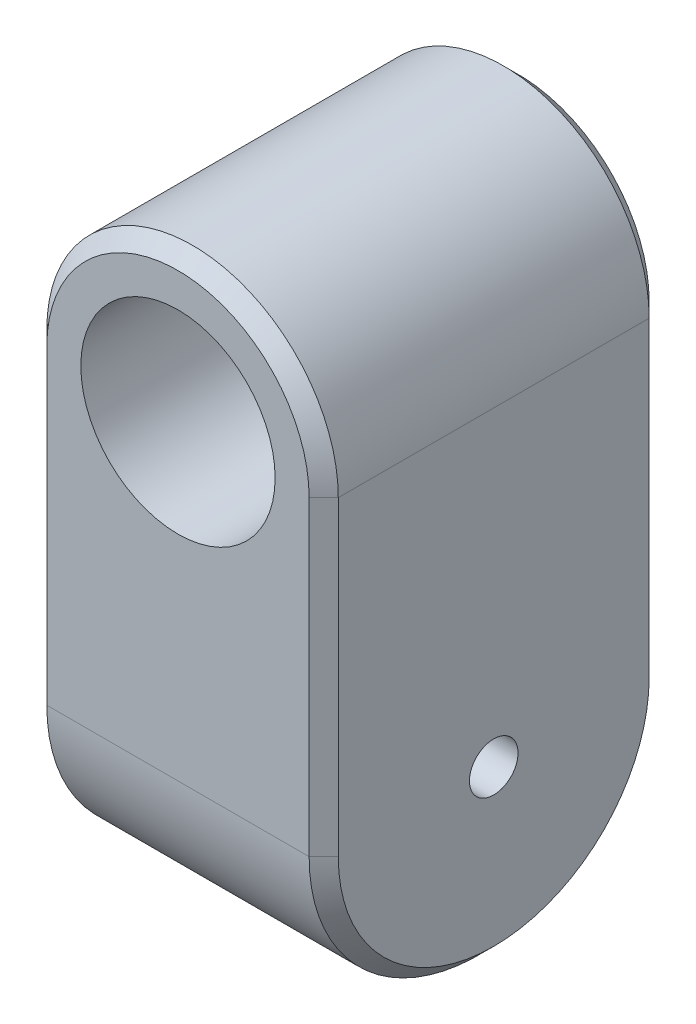
ISO-10303-21;
HEADER;
FILE_DESCRIPTION(('STEP AP214'),'2;1');
FILE_NAME('part.step','',(''),(''),'','','');
FILE_SCHEMA(('AUTOMOTIVE_DESIGN { 1 0 10303 214 1 1 1 1 }'));
ENDSEC;
DATA;
#1=APPLICATION_CONTEXT('core data for automotive mechanical design processes');
#2=APPLICATION_PROTOCOL_DEFINITION('international standard','automotive_design',2000,#1);
#3=PRODUCT_CONTEXT('',#1,'mechanical');
#4=PRODUCT('Part','Part','',(#3));
#5=PRODUCT_RELATED_PRODUCT_CATEGORY('part','',(#4));
#6=PRODUCT_DEFINITION_FORMATION('','',#4);
#7=PRODUCT_DEFINITION_CONTEXT('part definition',#1,'design');
#8=PRODUCT_DEFINITION('design','',#6,#7);
#9=PRODUCT_DEFINITION_SHAPE('','',#8);
#10=(LENGTH_UNIT() NAMED_UNIT(*) SI_UNIT(.MILLI.,.METRE.));
#11=(NAMED_UNIT(*) PLANE_ANGLE_UNIT() SI_UNIT($,.RADIAN.));
#12=(NAMED_UNIT(*) SI_UNIT($,.STERADIAN.) SOLID_ANGLE_UNIT());
#13=UNCERTAINTY_MEASURE_WITH_UNIT(LENGTH_MEASURE(1.E-05),#10,'distance_accuracy_value','');
#14=(GEOMETRIC_REPRESENTATION_CONTEXT(3) GLOBAL_UNCERTAINTY_ASSIGNED_CONTEXT((#13)) GLOBAL_UNIT_ASSIGNED_CONTEXT((#10,
#11,#12)) REPRESENTATION_CONTEXT('',''));
#15=CARTESIAN_POINT('',(0.,0.,0.));
#16=DIRECTION('',(0.,0.,1.));
#17=DIRECTION('',(1.,0.,0.));
#18=AXIS2_PLACEMENT_3D('',#15,#16,#17);
#19=CARTESIAN_POINT('',(75.,0.,0.));
#20=DIRECTION('',(1.,0.,0.));
#21=DIRECTION('',(0.,0.,-1.));
#22=AXIS2_PLACEMENT_3D('',#19,#20,#21);
#23=PLANE('',#22);
#24=CARTESIAN_POINT('',(75.,0.,0.));
#25=DIRECTION('',(1.,0.,0.));
#26=DIRECTION('',(0.,0.,-1.));
#27=AXIS2_PLACEMENT_3D('',#24,#25,#26);
#28=CIRCLE('',#27,79.9999999999999);
#29=CARTESIAN_POINT('',(75.,0.,79.9999999999999));
#30=VERTEX_POINT('',#29);
#31=CARTESIAN_POINT('',(75.,0.,-79.9999999999999));
#32=VERTEX_POINT('',#31);
#33=EDGE_CURVE('E224',#30,#32,#28,.T.);
#34=ORIENTED_EDGE('',*,*,#33,.T.);
#35=DIRECTION('',(0.,1.,0.));
#36=VECTOR('',#35,1.);
#37=CARTESIAN_POINT('',(75.,160.,-79.9999999999999));
#38=LINE('',#37,#36);
#39=CARTESIAN_POINT('',(75.,160.,-80.));
#40=VERTEX_POINT('',#39);
#41=EDGE_CURVE('E140',#32,#40,#38,.T.);
#42=ORIENTED_EDGE('',*,*,#41,.T.);
#43=DIRECTION('',(0.,0.,-1.));
#44=VECTOR('',#43,1.);
#45=CARTESIAN_POINT('',(75.,160.,299.632034355964));
#46=LINE('',#45,#44);
#47=CARTESIAN_POINT('',(75.,160.,79.9999999999999));
#48=VERTEX_POINT('',#47);
#49=EDGE_CURVE('E174',#48,#40,#46,.T.);
#50=ORIENTED_EDGE('',*,*,#49,.F.);
#51=DIRECTION('',(0.,-1.,0.));
#52=VECTOR('',#51,1.);
#53=CARTESIAN_POINT('',(75.,0.,79.9999999999999));
#54=LINE('',#53,#52);
#55=EDGE_CURVE('E221',#48,#30,#54,.T.);
#56=ORIENTED_EDGE('',*,*,#55,.T.);
#57=EDGE_LOOP('',(#34,#42,#50,#56));
#58=FACE_BOUND('',#57,.T.);
#59=CARTESIAN_POINT('',(75.,0.,0.));
#60=DIRECTION('',(1.,0.,0.));
#61=DIRECTION('',(0.,0.,-1.));
#62=AXIS2_PLACEMENT_3D('',#59,#60,#61);
#63=CIRCLE('',#62,12.5);
#64=CARTESIAN_POINT('',(75.,0.,-12.5));
#65=VERTEX_POINT('',#64);
#66=EDGE_CURVE('E191',#65,#65,#63,.T.);
#67=ORIENTED_EDGE('',*,*,#66,.F.);
#68=EDGE_LOOP('',(#67));
#69=FACE_BOUND('',#68,.T.);
#70=ADVANCED_FACE('F40',(#58,#69),#23,.T.);
#71=CARTESIAN_POINT('',(-75.,0.,0.));
#72=DIRECTION('',(1.,0.,0.));
#73=DIRECTION('',(0.,0.,-1.));
#74=AXIS2_PLACEMENT_3D('',#71,#72,#73);
#75=PLANE('',#74);
#76=DIRECTION('',(0.,0.,-1.));
#77=VECTOR('',#76,1.);
#78=CARTESIAN_POINT('',(-75.,160.,299.632034355964));
#79=LINE('',#78,#77);
#80=CARTESIAN_POINT('',(-75.,160.,79.9999999999999));
#81=VERTEX_POINT('',#80);
#82=CARTESIAN_POINT('',(-75.,160.,-80.));
#83=VERTEX_POINT('',#82);
#84=EDGE_CURVE('E180',#81,#83,#79,.T.);
#85=ORIENTED_EDGE('',*,*,#84,.T.);
#86=DIRECTION('',(0.,-1.,0.));
#87=VECTOR('',#86,1.);
#88=CARTESIAN_POINT('',(-75.,0.,-79.9999999999999));
#89=LINE('',#88,#87);
#90=CARTESIAN_POINT('',(-75.,0.,-79.9999999999999));
#91=VERTEX_POINT('',#90);
#92=EDGE_CURVE('E218',#83,#91,#89,.T.);
#93=ORIENTED_EDGE('',*,*,#92,.T.);
#94=CARTESIAN_POINT('',(-75.,0.,0.));
#95=DIRECTION('',(1.,0.,0.));
#96=DIRECTION('',(0.,0.,-1.));
#97=AXIS2_PLACEMENT_3D('',#94,#95,#96);
#98=CIRCLE('',#97,79.9999999999999);
#99=CARTESIAN_POINT('',(-75.,0.,79.9999999999999));
#100=VERTEX_POINT('',#99);
#101=EDGE_CURVE('E215',#91,#100,#98,.F.);
#102=ORIENTED_EDGE('',*,*,#101,.T.);
#103=DIRECTION('',(0.,1.,0.));
#104=VECTOR('',#103,1.);
#105=CARTESIAN_POINT('',(-75.,0.,79.9999999999999));
#106=LINE('',#105,#104);
#107=EDGE_CURVE('E212',#100,#81,#106,.T.);
#108=ORIENTED_EDGE('',*,*,#107,.T.);
#109=EDGE_LOOP('',(#85,#93,#102,#108));
#110=FACE_BOUND('',#109,.T.);
#111=CARTESIAN_POINT('',(-75.,0.,0.));
#112=DIRECTION('',(1.,0.,0.));
#113=DIRECTION('',(0.,0.,-1.));
#114=AXIS2_PLACEMENT_3D('',#111,#112,#113);
#115=CIRCLE('',#114,12.5);
#116=CARTESIAN_POINT('',(-75.,0.,-12.5));
#117=VERTEX_POINT('',#116);
#118=EDGE_CURVE('E190',#117,#117,#115,.T.);
#119=ORIENTED_EDGE('',*,*,#118,.T.);
#120=EDGE_LOOP('',(#119));
#121=FACE_BOUND('',#120,.T.);
#122=ADVANCED_FACE('F246',(#110,#121),#75,.F.);
#123=CARTESIAN_POINT('',(75.,0.,0.));
#124=DIRECTION('',(-1.,0.,0.));
#125=DIRECTION('',(0.,0.,1.));
#126=AXIS2_PLACEMENT_3D('',#123,#124,#125);
#127=CYLINDRICAL_SURFACE('',#126,87.5);
#128=DIRECTION('',(-1.,0.,0.));
#129=VECTOR('',#128,1.);
#130=CARTESIAN_POINT('',(75.,0.,87.5));
#131=LINE('',#130,#129);
#132=CARTESIAN_POINT('',(67.4999999999999,0.,87.5));
#133=VERTEX_POINT('',#132);
#134=CARTESIAN_POINT('',(-67.4999999999999,0.,87.5));
#135=VERTEX_POINT('',#134);
#136=EDGE_CURVE('E128',#133,#135,#131,.T.);
#137=ORIENTED_EDGE('',*,*,#136,.T.);
#138=CARTESIAN_POINT('',(-67.4999999999999,0.,0.));
#139=DIRECTION('',(1.,0.,0.));
#140=DIRECTION('',(0.,0.,-1.));
#141=AXIS2_PLACEMENT_3D('',#138,#139,#140);
#142=CIRCLE('',#141,87.5);
#143=CARTESIAN_POINT('',(-67.4999999999999,0.,-87.5));
#144=VERTEX_POINT('',#143);
#145=EDGE_CURVE('E126',#135,#144,#142,.T.);
#146=ORIENTED_EDGE('',*,*,#145,.T.);
#147=DIRECTION('',(-1.,0.,0.));
#148=VECTOR('',#147,1.);
#149=CARTESIAN_POINT('',(75.,0.,-87.5));
#150=LINE('',#149,#148);
#151=CARTESIAN_POINT('',(67.4999999999999,0.,-87.5));
#152=VERTEX_POINT('',#151);
#153=EDGE_CURVE('E111',#152,#144,#150,.T.);
#154=ORIENTED_EDGE('',*,*,#153,.F.);
#155=CARTESIAN_POINT('',(67.4999999999999,0.,0.));
#156=DIRECTION('',(1.,0.,0.));
#157=DIRECTION('',(0.,0.,-1.));
#158=AXIS2_PLACEMENT_3D('',#155,#156,#157);
#159=CIRCLE('',#158,87.5);
#160=EDGE_CURVE('E124',#152,#133,#159,.F.);
#161=ORIENTED_EDGE('',*,*,#160,.T.);
#162=EDGE_LOOP('',(#137,#146,#154,#161));
#163=FACE_BOUND('',#162,.T.);
#164=ADVANCED_FACE('F123',(#163),#127,.T.);
#165=CARTESIAN_POINT('',(75.,0.,-87.5));
#166=DIRECTION('',(0.,0.,1.));
#167=DIRECTION('',(1.,0.,0.));
#168=AXIS2_PLACEMENT_3D('',#165,#166,#167);
#169=PLANE('',#168);
#170=ORIENTED_EDGE('',*,*,#153,.T.);
#171=DIRECTION('',(0.,1.,0.));
#172=VECTOR('',#171,1.);
#173=CARTESIAN_POINT('',(-67.4999999999999,0.,-87.5));
#174=LINE('',#173,#172);
#175=CARTESIAN_POINT('',(-67.5,160.,-87.5));
#176=VERTEX_POINT('',#175);
#177=EDGE_CURVE('E202',#144,#176,#174,.T.);
#178=ORIENTED_EDGE('',*,*,#177,.T.);
#179=CARTESIAN_POINT('',(0.,160.,-87.5));
#180=DIRECTION('',(0.,0.,1.));
#181=DIRECTION('',(1.,0.,0.));
#182=AXIS2_PLACEMENT_3D('',#179,#180,#181);
#183=CIRCLE('',#182,67.5);
#184=CARTESIAN_POINT('',(67.4999999999999,160.,-87.5));
#185=VERTEX_POINT('',#184);
#186=EDGE_CURVE('E114',#176,#185,#183,.F.);
#187=ORIENTED_EDGE('',*,*,#186,.T.);
#188=DIRECTION('',(0.,-1.,0.));
#189=VECTOR('',#188,1.);
#190=CARTESIAN_POINT('',(67.4999999999999,0.,-87.5));
#191=LINE('',#190,#189);
#192=EDGE_CURVE('E107',#185,#152,#191,.T.);
#193=ORIENTED_EDGE('',*,*,#192,.T.);
#194=EDGE_LOOP('',(#170,#178,#187,#193));
#195=FACE_BOUND('',#194,.T.);
#196=CARTESIAN_POINT('',(0.,160.,-87.5));
#197=DIRECTION('',(0.,0.,1.));
#198=DIRECTION('',(1.,0.,0.));
#199=AXIS2_PLACEMENT_3D('',#196,#197,#198);
#200=CIRCLE('',#199,50.);
#201=CARTESIAN_POINT('',(50.,160.,-87.5));
#202=VERTEX_POINT('',#201);
#203=EDGE_CURVE('E168',#202,#202,#200,.F.);
#204=ORIENTED_EDGE('',*,*,#203,.F.);
#205=EDGE_LOOP('',(#204));
#206=FACE_BOUND('',#205,.T.);
#207=ADVANCED_FACE('F109',(#195,#206),#169,.F.);
#208=CARTESIAN_POINT('',(75.,0.,87.5));
#209=DIRECTION('',(0.,0.,-1.));
#210=DIRECTION('',(-1.,0.,0.));
#211=AXIS2_PLACEMENT_3D('',#208,#209,#210);
#212=PLANE('',#211);
#213=CARTESIAN_POINT('',(0.,160.,87.5));
#214=DIRECTION('',(0.,0.,-1.));
#215=DIRECTION('',(-1.,0.,0.));
#216=AXIS2_PLACEMENT_3D('',#213,#214,#215);
#217=CIRCLE('',#216,67.4999999999999);
#218=CARTESIAN_POINT('',(67.4999999999999,160.,87.5));
#219=VERTEX_POINT('',#218);
#220=CARTESIAN_POINT('',(-67.4999999999999,160.,87.5));
#221=VERTEX_POINT('',#220);
#222=EDGE_CURVE('E58',#219,#221,#217,.F.);
#223=ORIENTED_EDGE('',*,*,#222,.T.);
#224=DIRECTION('',(0.,-1.,0.));
#225=VECTOR('',#224,1.);
#226=CARTESIAN_POINT('',(-67.4999999999999,0.,87.5));
#227=LINE('',#226,#225);
#228=EDGE_CURVE('E11',#221,#135,#227,.T.);
#229=ORIENTED_EDGE('',*,*,#228,.T.);
#230=ORIENTED_EDGE('',*,*,#136,.F.);
#231=DIRECTION('',(0.,1.,0.));
#232=VECTOR('',#231,1.);
#233=CARTESIAN_POINT('',(67.4999999999999,160.,87.5));
#234=LINE('',#233,#232);
#235=EDGE_CURVE('E51',#133,#219,#234,.T.);
#236=ORIENTED_EDGE('',*,*,#235,.T.);
#237=EDGE_LOOP('',(#223,#229,#230,#236));
#238=FACE_BOUND('',#237,.T.);
#239=CARTESIAN_POINT('',(0.,160.,87.5));
#240=DIRECTION('',(0.,0.,-1.));
#241=DIRECTION('',(-1.,0.,0.));
#242=AXIS2_PLACEMENT_3D('',#239,#240,#241);
#243=CIRCLE('',#242,50.);
#244=CARTESIAN_POINT('',(-50.,160.,87.5));
#245=VERTEX_POINT('',#244);
#246=EDGE_CURVE('E185',#245,#245,#243,.T.);
#247=ORIENTED_EDGE('',*,*,#246,.T.);
#248=EDGE_LOOP('',(#247));
#249=FACE_BOUND('',#248,.T.);
#250=ADVANCED_FACE('F278',(#238,#249),#212,.F.);
#251=CARTESIAN_POINT('',(75.,0.,0.));
#252=DIRECTION('',(-1.,0.,0.));
#253=DIRECTION('',(0.,0.,1.));
#254=AXIS2_PLACEMENT_3D('',#251,#252,#253);
#255=CYLINDRICAL_SURFACE('',#254,12.5);
#256=ORIENTED_EDGE('',*,*,#66,.T.);
#257=EDGE_LOOP('',(#256));
#258=FACE_BOUND('',#257,.T.);
#259=ORIENTED_EDGE('',*,*,#118,.F.);
#260=EDGE_LOOP('',(#259));
#261=FACE_BOUND('',#260,.T.);
#262=ADVANCED_FACE('F275',(#258,#261),#255,.F.);
#263=CARTESIAN_POINT('',(0.,160.,299.632034355964));
#264=DIRECTION('',(0.,0.,-1.));
#265=DIRECTION('',(-1.,0.,0.));
#266=AXIS2_PLACEMENT_3D('',#263,#264,#265);
#267=CYLINDRICAL_SURFACE('',#266,75.);
#268=ORIENTED_EDGE('',*,*,#49,.T.);
#269=CARTESIAN_POINT('',(0.,160.,-80.));
#270=DIRECTION('',(0.,0.,1.));
#271=DIRECTION('',(1.,0.,0.));
#272=AXIS2_PLACEMENT_3D('',#269,#270,#271);
#273=CIRCLE('',#272,75.);
#274=EDGE_CURVE('E208',#40,#83,#273,.T.);
#275=ORIENTED_EDGE('',*,*,#274,.T.);
#276=ORIENTED_EDGE('',*,*,#84,.F.);
#277=CARTESIAN_POINT('',(0.,160.,79.9999999999999));
#278=DIRECTION('',(0.,0.,-1.));
#279=DIRECTION('',(-1.,0.,0.));
#280=AXIS2_PLACEMENT_3D('',#277,#278,#279);
#281=CIRCLE('',#280,75.);
#282=EDGE_CURVE('E205',#81,#48,#281,.T.);
#283=ORIENTED_EDGE('',*,*,#282,.T.);
#284=EDGE_LOOP('',(#268,#275,#276,#283));
#285=FACE_BOUND('',#284,.T.);
#286=ADVANCED_FACE('F242',(#285),#267,.T.);
#287=CARTESIAN_POINT('',(0.,160.,299.632034355964));
#288=DIRECTION('',(0.,0.,-1.));
#289=DIRECTION('',(-1.,0.,0.));
#290=AXIS2_PLACEMENT_3D('',#287,#288,#289);
#291=CYLINDRICAL_SURFACE('',#290,50.);
#292=ORIENTED_EDGE('',*,*,#246,.F.);
#293=EDGE_LOOP('',(#292));
#294=FACE_BOUND('',#293,.T.);
#295=ORIENTED_EDGE('',*,*,#203,.T.);
#296=EDGE_LOOP('',(#295));
#297=FACE_BOUND('',#296,.T.);
#298=ADVANCED_FACE('F316',(#294,#297),#291,.F.);
#299=CARTESIAN_POINT('',(0.,160.,79.9999999999999));
#300=DIRECTION('',(0.,0.,-1.));
#301=DIRECTION('',(-1.,0.,0.));
#302=AXIS2_PLACEMENT_3D('',#299,#300,#301);
#303=CONICAL_SURFACE('',#302,75.,0.785398163397448);
#304=DIRECTION('',(-0.707106781186548,0.,0.707106781186548));
#305=VECTOR('',#304,1.);
#306=CARTESIAN_POINT('',(75.,160.,79.9999999999999));
#307=LINE('',#306,#305);
#308=EDGE_CURVE('E160',#48,#219,#307,.T.);
#309=ORIENTED_EDGE('',*,*,#308,.F.);
#310=ORIENTED_EDGE('',*,*,#282,.F.);
#311=DIRECTION('',(-0.707106781186548,0.,-0.707106781186548));
#312=VECTOR('',#311,1.);
#313=CARTESIAN_POINT('',(-67.4999999999999,160.,87.5));
#314=LINE('',#313,#312);
#315=EDGE_CURVE('E45',#221,#81,#314,.T.);
#316=ORIENTED_EDGE('',*,*,#315,.F.);
#317=ORIENTED_EDGE('',*,*,#222,.F.);
#318=EDGE_LOOP('',(#309,#310,#316,#317));
#319=FACE_BOUND('',#318,.T.);
#320=ADVANCED_FACE('F43',(#319),#303,.T.);
#321=CARTESIAN_POINT('',(-67.4999999999999,0.,87.5));
#322=DIRECTION('',(0.707106781186548,0.,-0.707106781186548));
#323=DIRECTION('',(0.,-1.,0.));
#324=AXIS2_PLACEMENT_3D('',#321,#322,#323);
#325=PLANE('',#324);
#326=ORIENTED_EDGE('',*,*,#315,.T.);
#327=ORIENTED_EDGE('',*,*,#107,.F.);
#328=DIRECTION('',(-0.707106781186548,0.,-0.707106781186548));
#329=VECTOR('',#328,1.);
#330=CARTESIAN_POINT('',(-67.4999999999999,0.,87.5));
#331=LINE('',#330,#329);
#332=EDGE_CURVE('E157',#135,#100,#331,.T.);
#333=ORIENTED_EDGE('',*,*,#332,.F.);
#334=ORIENTED_EDGE('',*,*,#228,.F.);
#335=EDGE_LOOP('',(#326,#327,#333,#334));
#336=FACE_BOUND('',#335,.T.);
#337=ADVANCED_FACE('F250',(#336),#325,.F.);
#338=CARTESIAN_POINT('',(75.,0.,79.9999999999999));
#339=DIRECTION('',(0.707106781186548,0.,0.707106781186548));
#340=DIRECTION('',(0.,1.,0.));
#341=AXIS2_PLACEMENT_3D('',#338,#339,#340);
#342=PLANE('',#341);
#343=ORIENTED_EDGE('',*,*,#308,.T.);
#344=ORIENTED_EDGE('',*,*,#235,.F.);
#345=DIRECTION('',(-0.707106781186548,0.,0.707106781186548));
#346=VECTOR('',#345,1.);
#347=CARTESIAN_POINT('',(75.,0.,79.9999999999999));
#348=LINE('',#347,#346);
#349=EDGE_CURVE('E138',#30,#133,#348,.T.);
#350=ORIENTED_EDGE('',*,*,#349,.F.);
#351=ORIENTED_EDGE('',*,*,#55,.F.);
#352=EDGE_LOOP('',(#343,#344,#350,#351));
#353=FACE_BOUND('',#352,.T.);
#354=ADVANCED_FACE('F306',(#353),#342,.T.);
#355=CARTESIAN_POINT('',(-67.4999999999999,0.,0.));
#356=DIRECTION('',(1.,0.,0.));
#357=DIRECTION('',(0.,0.,-1.));
#358=AXIS2_PLACEMENT_3D('',#355,#356,#357);
#359=CONICAL_SURFACE('',#358,87.5,0.785398163397448);
#360=ORIENTED_EDGE('',*,*,#332,.T.);
#361=ORIENTED_EDGE('',*,*,#101,.F.);
#362=DIRECTION('',(-0.707106781186548,0.,0.707106781186548));
#363=VECTOR('',#362,1.);
#364=CARTESIAN_POINT('',(-67.4999999999999,0.,-87.5));
#365=LINE('',#364,#363);
#366=EDGE_CURVE('E144',#144,#91,#365,.T.);
#367=ORIENTED_EDGE('',*,*,#366,.F.);
#368=ORIENTED_EDGE('',*,*,#145,.F.);
#369=EDGE_LOOP('',(#360,#361,#367,#368));
#370=FACE_BOUND('',#369,.T.);
#371=ADVANCED_FACE('F252',(#370),#359,.T.);
#372=CARTESIAN_POINT('',(75.,0.,0.));
#373=DIRECTION('',(-1.,0.,0.));
#374=DIRECTION('',(0.,0.,1.));
#375=AXIS2_PLACEMENT_3D('',#372,#373,#374);
#376=CONICAL_SURFACE('',#375,79.9999999999999,0.785398163397448);
#377=ORIENTED_EDGE('',*,*,#349,.T.);
#378=ORIENTED_EDGE('',*,*,#160,.F.);
#379=DIRECTION('',(-0.707106781186548,0.,-0.707106781186548));
#380=VECTOR('',#379,1.);
#381=CARTESIAN_POINT('',(75.,0.,-79.9999999999999));
#382=LINE('',#381,#380);
#383=EDGE_CURVE('E135',#32,#152,#382,.T.);
#384=ORIENTED_EDGE('',*,*,#383,.F.);
#385=ORIENTED_EDGE('',*,*,#33,.F.);
#386=EDGE_LOOP('',(#377,#378,#384,#385));
#387=FACE_BOUND('',#386,.T.);
#388=ADVANCED_FACE('F133',(#387),#376,.T.);
#389=CARTESIAN_POINT('',(-67.4999999999999,0.,-87.5));
#390=DIRECTION('',(0.707106781186548,0.,0.707106781186548));
#391=DIRECTION('',(0.,1.,0.));
#392=AXIS2_PLACEMENT_3D('',#389,#390,#391);
#393=PLANE('',#392);
#394=ORIENTED_EDGE('',*,*,#366,.T.);
#395=ORIENTED_EDGE('',*,*,#92,.F.);
#396=DIRECTION('',(-0.707106781186548,0.,0.707106781186548));
#397=VECTOR('',#396,1.);
#398=CARTESIAN_POINT('',(-67.4999999999999,160.,-87.5));
#399=LINE('',#398,#397);
#400=EDGE_CURVE('E145',#176,#83,#399,.T.);
#401=ORIENTED_EDGE('',*,*,#400,.F.);
#402=ORIENTED_EDGE('',*,*,#177,.F.);
#403=EDGE_LOOP('',(#394,#395,#401,#402));
#404=FACE_BOUND('',#403,.T.);
#405=ADVANCED_FACE('F255',(#404),#393,.F.);
#406=CARTESIAN_POINT('',(75.,0.,-79.9999999999999));
#407=DIRECTION('',(0.707106781186548,0.,-0.707106781186548));
#408=DIRECTION('',(0.,-1.,0.));
#409=AXIS2_PLACEMENT_3D('',#406,#407,#408);
#410=PLANE('',#409);
#411=ORIENTED_EDGE('',*,*,#383,.T.);
#412=ORIENTED_EDGE('',*,*,#192,.F.);
#413=DIRECTION('',(-0.707106781186548,0.,-0.707106781186548));
#414=VECTOR('',#413,1.);
#415=CARTESIAN_POINT('',(75.,160.,-79.9999999999999));
#416=LINE('',#415,#414);
#417=EDGE_CURVE('E151',#40,#185,#416,.T.);
#418=ORIENTED_EDGE('',*,*,#417,.F.);
#419=ORIENTED_EDGE('',*,*,#41,.F.);
#420=EDGE_LOOP('',(#411,#412,#418,#419));
#421=FACE_BOUND('',#420,.T.);
#422=ADVANCED_FACE('F142',(#421),#410,.T.);
#423=CARTESIAN_POINT('',(0.,160.,-87.5));
#424=DIRECTION('',(0.,0.,1.));
#425=DIRECTION('',(1.,0.,0.));
#426=AXIS2_PLACEMENT_3D('',#423,#424,#425);
#427=CONICAL_SURFACE('',#426,67.4999999999999,0.785398163397448);
#428=ORIENTED_EDGE('',*,*,#400,.T.);
#429=ORIENTED_EDGE('',*,*,#274,.F.);
#430=ORIENTED_EDGE('',*,*,#417,.T.);
#431=ORIENTED_EDGE('',*,*,#186,.F.);
#432=EDGE_LOOP('',(#428,#429,#430,#431));
#433=FACE_BOUND('',#432,.T.);
#434=ADVANCED_FACE('F237',(#433),#427,.T.);
#435=CLOSED_SHELL('',(#70,#122,#164,#207,#250,#262,#286,#298,#320,#337,#354,#371,#388,#405,#422,#434));
#436=MANIFOLD_SOLID_BREP('B2',#435);
#437=ADVANCED_BREP_SHAPE_REPRESENTATION('',(#18,#436),#14);
#438=SHAPE_DEFINITION_REPRESENTATION(#9,#437);
ENDSEC;
END-ISO-10303-21;
